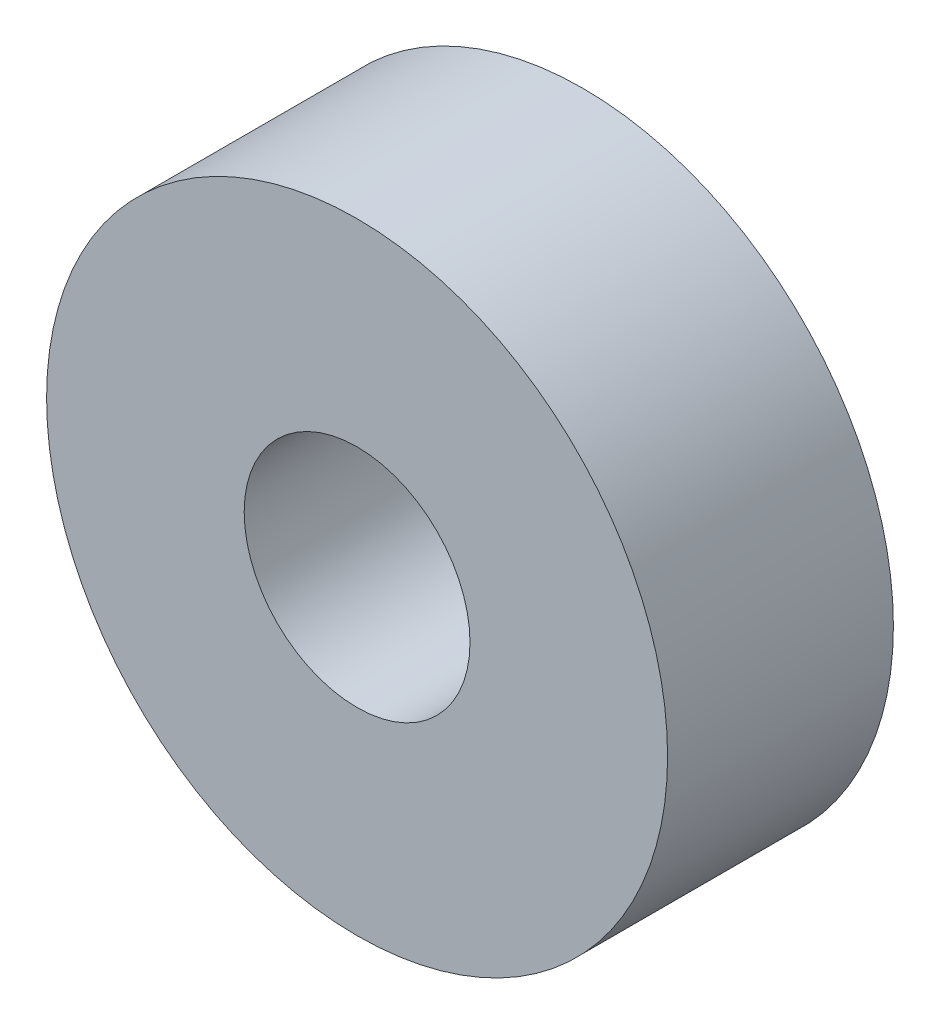
ISO-10303-21;
HEADER;
FILE_DESCRIPTION(('STEP AP214'),'2;1');
FILE_NAME('part.step','',(''),(''),'','','');
FILE_SCHEMA(('AUTOMOTIVE_DESIGN { 1 0 10303 214 1 1 1 1 }'));
ENDSEC;
DATA;
#1=APPLICATION_CONTEXT('core data for automotive mechanical design processes');
#2=APPLICATION_PROTOCOL_DEFINITION('international standard','automotive_design',2000,#1);
#3=PRODUCT_CONTEXT('',#1,'mechanical');
#4=PRODUCT('Part','Part','',(#3));
#5=PRODUCT_RELATED_PRODUCT_CATEGORY('part','',(#4));
#6=PRODUCT_DEFINITION_FORMATION('','',#4);
#7=PRODUCT_DEFINITION_CONTEXT('part definition',#1,'design');
#8=PRODUCT_DEFINITION('design','',#6,#7);
#9=PRODUCT_DEFINITION_SHAPE('','',#8);
#10=(LENGTH_UNIT() NAMED_UNIT(*) SI_UNIT(.MILLI.,.METRE.));
#11=(NAMED_UNIT(*) PLANE_ANGLE_UNIT() SI_UNIT($,.RADIAN.));
#12=(NAMED_UNIT(*) SI_UNIT($,.STERADIAN.) SOLID_ANGLE_UNIT());
#13=UNCERTAINTY_MEASURE_WITH_UNIT(LENGTH_MEASURE(1.E-05),#10,'distance_accuracy_value','');
#14=(GEOMETRIC_REPRESENTATION_CONTEXT(3) GLOBAL_UNCERTAINTY_ASSIGNED_CONTEXT((#13)) GLOBAL_UNIT_ASSIGNED_CONTEXT((#10,
#11,#12)) REPRESENTATION_CONTEXT('',''));
#15=CARTESIAN_POINT('',(0.,0.,0.));
#16=DIRECTION('',(0.,0.,1.));
#17=DIRECTION('',(1.,0.,0.));
#18=AXIS2_PLACEMENT_3D('',#15,#16,#17);
#19=CARTESIAN_POINT('',(0.,0.,4.));
#20=DIRECTION('',(0.,0.,1.));
#21=DIRECTION('',(1.,0.,0.));
#22=AXIS2_PLACEMENT_3D('',#19,#20,#21);
#23=PLANE('',#22);
#24=CARTESIAN_POINT('',(0.,0.,4.));
#25=DIRECTION('',(0.,0.,1.));
#26=DIRECTION('',(1.,0.,0.));
#27=AXIS2_PLACEMENT_3D('',#24,#25,#26);
#28=CIRCLE('',#27,5.5);
#29=CARTESIAN_POINT('',(5.5,0.,4.));
#30=VERTEX_POINT('',#29);
#31=EDGE_CURVE('E10',#30,#30,#28,.T.);
#32=ORIENTED_EDGE('',*,*,#31,.T.);
#33=EDGE_LOOP('',(#32));
#34=FACE_BOUND('',#33,.T.);
#35=CARTESIAN_POINT('',(0.,0.,4.));
#36=DIRECTION('',(0.,0.,1.));
#37=DIRECTION('',(1.,0.,0.));
#38=AXIS2_PLACEMENT_3D('',#35,#36,#37);
#39=CIRCLE('',#38,2.);
#40=CARTESIAN_POINT('',(2.,0.,4.));
#41=VERTEX_POINT('',#40);
#42=EDGE_CURVE('E46',#41,#41,#39,.T.);
#43=ORIENTED_EDGE('',*,*,#42,.F.);
#44=EDGE_LOOP('',(#43));
#45=FACE_BOUND('',#44,.T.);
#46=ADVANCED_FACE('F35',(#34,#45),#23,.T.);
#47=CARTESIAN_POINT('',(0.,0.,0.));
#48=DIRECTION('',(0.,0.,1.));
#49=DIRECTION('',(1.,0.,0.));
#50=AXIS2_PLACEMENT_3D('',#47,#48,#49);
#51=PLANE('',#50);
#52=CARTESIAN_POINT('',(0.,0.,0.));
#53=DIRECTION('',(0.,0.,1.));
#54=DIRECTION('',(1.,0.,0.));
#55=AXIS2_PLACEMENT_3D('',#52,#53,#54);
#56=CIRCLE('',#55,5.5);
#57=CARTESIAN_POINT('',(5.5,0.,0.));
#58=VERTEX_POINT('',#57);
#59=EDGE_CURVE('E39',#58,#58,#56,.T.);
#60=ORIENTED_EDGE('',*,*,#59,.F.);
#61=EDGE_LOOP('',(#60));
#62=FACE_BOUND('',#61,.T.);
#63=CARTESIAN_POINT('',(0.,0.,0.));
#64=DIRECTION('',(0.,0.,1.));
#65=DIRECTION('',(1.,0.,0.));
#66=AXIS2_PLACEMENT_3D('',#63,#64,#65);
#67=CIRCLE('',#66,2.);
#68=CARTESIAN_POINT('',(2.,0.,0.));
#69=VERTEX_POINT('',#68);
#70=EDGE_CURVE('E48',#69,#69,#67,.T.);
#71=ORIENTED_EDGE('',*,*,#70,.T.);
#72=EDGE_LOOP('',(#71));
#73=FACE_BOUND('',#72,.T.);
#74=ADVANCED_FACE('F58',(#62,#73),#51,.F.);
#75=CARTESIAN_POINT('',(0.,0.,4.));
#76=DIRECTION('',(0.,0.,-1.));
#77=DIRECTION('',(-1.,0.,0.));
#78=AXIS2_PLACEMENT_3D('',#75,#76,#77);
#79=CYLINDRICAL_SURFACE('',#78,5.5);
#80=ORIENTED_EDGE('',*,*,#31,.F.);
#81=EDGE_LOOP('',(#80));
#82=FACE_BOUND('',#81,.T.);
#83=ORIENTED_EDGE('',*,*,#59,.T.);
#84=EDGE_LOOP('',(#83));
#85=FACE_BOUND('',#84,.T.);
#86=ADVANCED_FACE('F37',(#82,#85),#79,.T.);
#87=CARTESIAN_POINT('',(0.,0.,4.));
#88=DIRECTION('',(0.,0.,-1.));
#89=DIRECTION('',(-1.,0.,0.));
#90=AXIS2_PLACEMENT_3D('',#87,#88,#89);
#91=CYLINDRICAL_SURFACE('',#90,2.);
#92=ORIENTED_EDGE('',*,*,#42,.T.);
#93=EDGE_LOOP('',(#92));
#94=FACE_BOUND('',#93,.T.);
#95=ORIENTED_EDGE('',*,*,#70,.F.);
#96=EDGE_LOOP('',(#95));
#97=FACE_BOUND('',#96,.T.);
#98=ADVANCED_FACE('F54',(#94,#97),#91,.F.);
#99=CLOSED_SHELL('',(#46,#74,#86,#98));
#100=MANIFOLD_SOLID_BREP('B2',#99);
#101=ADVANCED_BREP_SHAPE_REPRESENTATION('',(#18,#100),#14);
#102=SHAPE_DEFINITION_REPRESENTATION(#9,#101);
ENDSEC;
END-ISO-10303-21;
